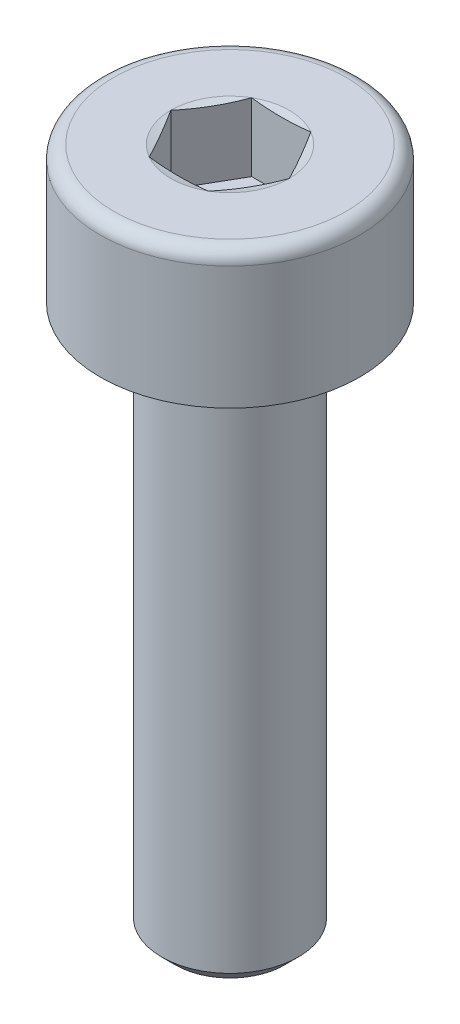
ISO-10303-21;
HEADER;
FILE_DESCRIPTION(('STEP AP214'),'2;1');
FILE_NAME('part.step','',(''),(''),'','','');
FILE_SCHEMA(('AUTOMOTIVE_DESIGN { 1 0 10303 214 1 1 1 1 }'));
ENDSEC;
DATA;
#1=APPLICATION_CONTEXT('core data for automotive mechanical design processes');
#2=APPLICATION_PROTOCOL_DEFINITION('international standard','automotive_design',2000,#1);
#3=PRODUCT_CONTEXT('',#1,'mechanical');
#4=PRODUCT('Part','Part','',(#3));
#5=PRODUCT_RELATED_PRODUCT_CATEGORY('part','',(#4));
#6=PRODUCT_DEFINITION_FORMATION('','',#4);
#7=PRODUCT_DEFINITION_CONTEXT('part definition',#1,'design');
#8=PRODUCT_DEFINITION('design','',#6,#7);
#9=PRODUCT_DEFINITION_SHAPE('','',#8);
#10=(LENGTH_UNIT() NAMED_UNIT(*) SI_UNIT(.MILLI.,.METRE.));
#11=(NAMED_UNIT(*) PLANE_ANGLE_UNIT() SI_UNIT($,.RADIAN.));
#12=(NAMED_UNIT(*) SI_UNIT($,.STERADIAN.) SOLID_ANGLE_UNIT());
#13=UNCERTAINTY_MEASURE_WITH_UNIT(LENGTH_MEASURE(1.E-05),#10,'distance_accuracy_value','');
#14=(GEOMETRIC_REPRESENTATION_CONTEXT(3) GLOBAL_UNCERTAINTY_ASSIGNED_CONTEXT((#13)) GLOBAL_UNIT_ASSIGNED_CONTEXT((#10,
#11,#12)) REPRESENTATION_CONTEXT('',''));
#15=CARTESIAN_POINT('',(0.,0.,0.));
#16=DIRECTION('',(0.,0.,1.));
#17=DIRECTION('',(1.,0.,0.));
#18=AXIS2_PLACEMENT_3D('',#15,#16,#17);
#19=CARTESIAN_POINT('',(-0.43301270189222,1.,-0.75));
#20=DIRECTION('',(0.,-1.,0.));
#21=DIRECTION('',(0.,0.,-1.));
#22=AXIS2_PLACEMENT_3D('',#19,#20,#21);
#23=PLANE('',#22);
#24=DIRECTION('',(0.5,0.,0.866025403784438));
#25=VECTOR('',#24,1.);
#26=CARTESIAN_POINT('',(-0.433012701892219,1.,0.75));
#27=LINE('',#26,#25);
#28=CARTESIAN_POINT('',(-0.866025403784439,1.,0.));
#29=VERTEX_POINT('',#28);
#30=CARTESIAN_POINT('',(-0.433012701892219,1.,0.75));
#31=VERTEX_POINT('',#30);
#32=EDGE_CURVE('E233',#29,#31,#27,.T.);
#33=ORIENTED_EDGE('',*,*,#32,.T.);
#34=DIRECTION('',(1.,0.,0.));
#35=VECTOR('',#34,1.);
#36=CARTESIAN_POINT('',(0.433012701892219,1.,0.75));
#37=LINE('',#36,#35);
#38=CARTESIAN_POINT('',(0.433012701892219,1.,0.75));
#39=VERTEX_POINT('',#38);
#40=EDGE_CURVE('E237',#31,#39,#37,.T.);
#41=ORIENTED_EDGE('',*,*,#40,.T.);
#42=DIRECTION('',(0.5,0.,-0.866025403784438));
#43=VECTOR('',#42,1.);
#44=CARTESIAN_POINT('',(0.866025403784439,1.,0.));
#45=LINE('',#44,#43);
#46=CARTESIAN_POINT('',(0.866025403784439,1.,0.));
#47=VERTEX_POINT('',#46);
#48=EDGE_CURVE('E240',#39,#47,#45,.T.);
#49=ORIENTED_EDGE('',*,*,#48,.T.);
#50=DIRECTION('',(-0.5,0.,-0.866025403784439));
#51=VECTOR('',#50,1.);
#52=CARTESIAN_POINT('',(0.43301270189222,1.,-0.75));
#53=LINE('',#52,#51);
#54=CARTESIAN_POINT('',(0.43301270189222,1.,-0.75));
#55=VERTEX_POINT('',#54);
#56=EDGE_CURVE('E96',#47,#55,#53,.T.);
#57=ORIENTED_EDGE('',*,*,#56,.T.);
#58=DIRECTION('',(-1.,0.,0.));
#59=VECTOR('',#58,1.);
#60=CARTESIAN_POINT('',(-0.43301270189222,1.,-0.75));
#61=LINE('',#60,#59);
#62=CARTESIAN_POINT('',(-0.43301270189222,1.,-0.75));
#63=VERTEX_POINT('',#62);
#64=EDGE_CURVE('E223',#55,#63,#61,.T.);
#65=ORIENTED_EDGE('',*,*,#64,.T.);
#66=DIRECTION('',(-0.5,0.,0.866025403784439));
#67=VECTOR('',#66,1.);
#68=CARTESIAN_POINT('',(-0.866025403784439,1.,0.));
#69=LINE('',#68,#67);
#70=EDGE_CURVE('E228',#63,#29,#69,.T.);
#71=ORIENTED_EDGE('',*,*,#70,.T.);
#72=EDGE_LOOP('',(#33,#41,#49,#57,#65,#71));
#73=FACE_BOUND('',#72,.T.);
#74=ADVANCED_FACE('F17',(#73),#23,.F.);
#75=CARTESIAN_POINT('',(0.866025403784439,1.,0.));
#76=DIRECTION('',(0.866025403784438,0.,0.5));
#77=DIRECTION('',(0.5,0.,-0.866025403784438));
#78=AXIS2_PLACEMENT_3D('',#75,#76,#77);
#79=PLANE('',#78);
#80=CARTESIAN_POINT('',(0.43301270189222,2.,0.75));
#81=CARTESIAN_POINT('',(0.458011996942442,1.99332894284484,0.706699950819609));
#82=CARTESIAN_POINT('',(0.483084241722884,1.9878511257841,0.663273549000079));
#83=CARTESIAN_POINT('',(0.533331856783253,1.97923324222689,0.576242126756357));
#84=CARTESIAN_POINT('',(0.558507237671917,1.9760934226167,0.532637087957293));
#85=CARTESIAN_POINT('',(0.633798363297738,1.97013471304087,0.402229033014321));
#86=CARTESIAN_POINT('',(0.683995304960254,1.9706938931653,0.31528537967027));
#87=CARTESIAN_POINT('',(0.75609458989346,1.97803638281175,0.190405754976572));
#88=CARTESIAN_POINT('',(0.778106545273776,1.98116039104902,0.152279929883928));
#89=CARTESIAN_POINT('',(0.822106353110896,1.98921327605727,0.0760700271867688));
#90=CARTESIAN_POINT('',(0.844093987710657,1.99414690623184,0.0379863269217234));
#91=CARTESIAN_POINT('',(0.866025403784438,2.,0.));
#92=B_SPLINE_CURVE_WITH_KNOTS('',3,(#80,#81,#82,#83,#84,#85,#86,#87,#88,#89,#90,#91),
.UNSPECIFIED.,.F.,.F.,(4,2,2,2,2,4),(0.,0.151285873320482,0.302587719760197,0.603284766353558,
0.735660385742495,0.868386240938901),.UNSPECIFIED.);
#93=CARTESIAN_POINT('',(0.433012701892219,2.,0.75));
#94=VERTEX_POINT('',#93);
#95=CARTESIAN_POINT('',(0.866025403784439,2.,0.));
#96=VERTEX_POINT('',#95);
#97=EDGE_CURVE('E79',#94,#96,#92,.T.);
#98=ORIENTED_EDGE('',*,*,#97,.T.);
#99=DIRECTION('',(0.,1.,0.));
#100=VECTOR('',#99,1.);
#101=CARTESIAN_POINT('',(0.866025403784439,1.,0.));
#102=LINE('',#101,#100);
#103=EDGE_CURVE('E82',#96,#47,#102,.F.);
#104=ORIENTED_EDGE('',*,*,#103,.T.);
#105=ORIENTED_EDGE('',*,*,#48,.F.);
#106=DIRECTION('',(0.,1.,0.));
#107=VECTOR('',#106,1.);
#108=CARTESIAN_POINT('',(0.433012701892219,1.,0.75));
#109=LINE('',#108,#107);
#110=EDGE_CURVE('E75',#39,#94,#109,.T.);
#111=ORIENTED_EDGE('',*,*,#110,.T.);
#112=EDGE_LOOP('',(#98,#104,#105,#111));
#113=FACE_BOUND('',#112,.T.);
#114=ADVANCED_FACE('F81',(#113),#79,.F.);
#115=CARTESIAN_POINT('',(0.433012701892219,1.,0.75));
#116=DIRECTION('',(0.,0.,1.));
#117=DIRECTION('',(1.,0.,0.));
#118=AXIS2_PLACEMENT_3D('',#115,#116,#117);
#119=PLANE('',#118);
#120=CARTESIAN_POINT('',(-0.43301270189222,2.,0.75));
#121=CARTESIAN_POINT('',(-0.383014111791775,1.99332894284484,0.75));
#122=CARTESIAN_POINT('',(-0.332869622230889,1.9878511257841,0.75));
#123=CARTESIAN_POINT('',(-0.232374392110151,1.97923324222689,0.75));
#124=CARTESIAN_POINT('',(-0.182023630332824,1.9760934226167,0.75));
#125=CARTESIAN_POINT('',(-0.0314413790811828,1.97013471304087,0.75));
#126=CARTESIAN_POINT('',(0.0689525042438513,1.9706938931653,0.75));
#127=CARTESIAN_POINT('',(0.213151074110263,1.97803638281175,0.75));
#128=CARTESIAN_POINT('',(0.257174984870893,1.98116039104902,0.75));
#129=CARTESIAN_POINT('',(0.345174600545133,1.98921327605727,0.75));
#130=CARTESIAN_POINT('',(0.389149869744655,1.99414690623184,0.75));
#131=CARTESIAN_POINT('',(0.433012701892219,2.,0.75));
#132=B_SPLINE_CURVE_WITH_KNOTS('',3,(#120,#121,#122,#123,#124,#125,#126,#127,#128,#129,#130,
#131),.UNSPECIFIED.,.F.,.F.,(4,2,2,2,2,4),(0.,0.151285873320482,0.302587719760197,
0.603284766353558,0.735660385742495,0.868386240938901),.UNSPECIFIED.);
#133=CARTESIAN_POINT('',(-0.433012701892219,2.,0.75));
#134=VERTEX_POINT('',#133);
#135=EDGE_CURVE('E87',#134,#94,#132,.T.);
#136=ORIENTED_EDGE('',*,*,#135,.T.);
#137=ORIENTED_EDGE('',*,*,#110,.F.);
#138=ORIENTED_EDGE('',*,*,#40,.F.);
#139=DIRECTION('',(0.,1.,0.));
#140=VECTOR('',#139,1.);
#141=CARTESIAN_POINT('',(-0.433012701892219,1.,0.75));
#142=LINE('',#141,#140);
#143=EDGE_CURVE('E231',#31,#134,#142,.T.);
#144=ORIENTED_EDGE('',*,*,#143,.T.);
#145=EDGE_LOOP('',(#136,#137,#138,#144));
#146=FACE_BOUND('',#145,.T.);
#147=ADVANCED_FACE('F195',(#146),#119,.F.);
#148=CARTESIAN_POINT('',(-0.433012701892219,1.,0.75));
#149=DIRECTION('',(-0.866025403784438,0.,0.5));
#150=DIRECTION('',(0.5,0.,0.866025403784438));
#151=AXIS2_PLACEMENT_3D('',#148,#149,#150);
#152=PLANE('',#151);
#153=CARTESIAN_POINT('',(-0.866025403784439,2.,0.));
#154=CARTESIAN_POINT('',(-0.841026108734216,1.99332894284484,0.0433000491803905));
#155=CARTESIAN_POINT('',(-0.815953863953774,1.9878511257841,0.0867264509999211));
#156=CARTESIAN_POINT('',(-0.765706248893405,1.97923324222689,0.173757873243643));
#157=CARTESIAN_POINT('',(-0.740530868004741,1.9760934226167,0.217362912042706));
#158=CARTESIAN_POINT('',(-0.665239742378921,1.97013471304087,0.347770966985679));
#159=CARTESIAN_POINT('',(-0.615042800716404,1.9706938931653,0.43471462032973));
#160=CARTESIAN_POINT('',(-0.542943515783198,1.97803638281175,0.559594245023428));
#161=CARTESIAN_POINT('',(-0.520931560402882,1.98116039104902,0.597720070116072));
#162=CARTESIAN_POINT('',(-0.476931752565762,1.98921327605727,0.673929972813231));
#163=CARTESIAN_POINT('',(-0.454944117966001,1.99414690623184,0.712013673078277));
#164=CARTESIAN_POINT('',(-0.433012701892219,2.,0.75));
#165=B_SPLINE_CURVE_WITH_KNOTS('',3,(#153,#154,#155,#156,#157,#158,#159,#160,#161,#162,#163,
#164),.UNSPECIFIED.,.F.,.F.,(4,2,2,2,2,4),(0.,0.151285873320482,0.302587719760197,
0.603284766353558,0.735660385742495,0.868386240938901),.UNSPECIFIED.);
#166=CARTESIAN_POINT('',(-0.866025403784439,2.,0.));
#167=VERTEX_POINT('',#166);
#168=EDGE_CURVE('E179',#167,#134,#165,.T.);
#169=ORIENTED_EDGE('',*,*,#168,.T.);
#170=ORIENTED_EDGE('',*,*,#143,.F.);
#171=ORIENTED_EDGE('',*,*,#32,.F.);
#172=DIRECTION('',(0.,1.,0.));
#173=VECTOR('',#172,1.);
#174=CARTESIAN_POINT('',(-0.866025403784439,1.,0.));
#175=LINE('',#174,#173);
#176=EDGE_CURVE('E226',#29,#167,#175,.T.);
#177=ORIENTED_EDGE('',*,*,#176,.T.);
#178=EDGE_LOOP('',(#169,#170,#171,#177));
#179=FACE_BOUND('',#178,.T.);
#180=ADVANCED_FACE('F189',(#179),#152,.F.);
#181=CARTESIAN_POINT('',(-0.866025403784439,1.,0.));
#182=DIRECTION('',(-0.866025403784439,0.,-0.5));
#183=DIRECTION('',(-0.5,0.,0.866025403784439));
#184=AXIS2_PLACEMENT_3D('',#181,#182,#183);
#185=PLANE('',#184);
#186=CARTESIAN_POINT('',(-0.43301270189222,2.,-0.75));
#187=CARTESIAN_POINT('',(-0.458011996942442,1.99332894284484,-0.706699950819609));
#188=CARTESIAN_POINT('',(-0.483084241722885,1.9878511257841,-0.663273549000078));
#189=CARTESIAN_POINT('',(-0.533331856783254,1.97923324222689,-0.576242126756356));
#190=CARTESIAN_POINT('',(-0.558507237671917,1.9760934226167,-0.532637087957293));
#191=CARTESIAN_POINT('',(-0.633798363297738,1.97013471304087,-0.40222903301432));
#192=CARTESIAN_POINT('',(-0.683995304960255,1.9706938931653,-0.31528537967027));
#193=CARTESIAN_POINT('',(-0.756094589893461,1.97803638281175,-0.190405754976572));
#194=CARTESIAN_POINT('',(-0.778106545273776,1.98116039104902,-0.152279929883927));
#195=CARTESIAN_POINT('',(-0.822106353110896,1.98921327605727,-0.0760700271867685));
#196=CARTESIAN_POINT('',(-0.844093987710657,1.99414690623184,-0.0379863269217232));
#197=CARTESIAN_POINT('',(-0.866025403784439,2.,0.));
#198=B_SPLINE_CURVE_WITH_KNOTS('',3,(#186,#187,#188,#189,#190,#191,#192,#193,#194,#195,#196,
#197),.UNSPECIFIED.,.F.,.F.,(4,2,2,2,2,4),(0.,0.151285873320482,0.302587719760197,
0.603284766353558,0.735660385742494,0.8683862409389),.UNSPECIFIED.);
#199=CARTESIAN_POINT('',(-0.43301270189222,2.,-0.75));
#200=VERTEX_POINT('',#199);
#201=EDGE_CURVE('E172',#200,#167,#198,.T.);
#202=ORIENTED_EDGE('',*,*,#201,.T.);
#203=ORIENTED_EDGE('',*,*,#176,.F.);
#204=ORIENTED_EDGE('',*,*,#70,.F.);
#205=DIRECTION('',(0.,1.,0.));
#206=VECTOR('',#205,1.);
#207=CARTESIAN_POINT('',(-0.43301270189222,1.,-0.75));
#208=LINE('',#207,#206);
#209=EDGE_CURVE('E221',#63,#200,#208,.T.);
#210=ORIENTED_EDGE('',*,*,#209,.T.);
#211=EDGE_LOOP('',(#202,#203,#204,#210));
#212=FACE_BOUND('',#211,.T.);
#213=ADVANCED_FACE('F185',(#212),#185,.F.);
#214=CARTESIAN_POINT('',(-0.43301270189222,1.,-0.75));
#215=DIRECTION('',(0.,0.,-1.));
#216=DIRECTION('',(-1.,0.,0.));
#217=AXIS2_PLACEMENT_3D('',#214,#215,#216);
#218=PLANE('',#217);
#219=CARTESIAN_POINT('',(0.433012701892219,2.,-0.75));
#220=CARTESIAN_POINT('',(0.383014111791774,1.99332894284484,-0.75));
#221=CARTESIAN_POINT('',(0.332869622230888,1.9878511257841,-0.75));
#222=CARTESIAN_POINT('',(0.23237439211015,1.97923324222689,-0.75));
#223=CARTESIAN_POINT('',(0.182023630332824,1.9760934226167,-0.75));
#224=CARTESIAN_POINT('',(0.0314413790811823,1.97013471304087,-0.75));
#225=CARTESIAN_POINT('',(-0.0689525042438517,1.9706938931653,-0.750000000000001));
#226=CARTESIAN_POINT('',(-0.213151074110264,1.97803638281175,-0.75));
#227=CARTESIAN_POINT('',(-0.257174984870894,1.98116039104902,-0.75));
#228=CARTESIAN_POINT('',(-0.345174600545134,1.98921327605727,-0.749999999999999));
#229=CARTESIAN_POINT('',(-0.389149869744656,1.99414690623184,-0.749999999999999));
#230=CARTESIAN_POINT('',(-0.43301270189222,2.,-0.749999999999999));
#231=B_SPLINE_CURVE_WITH_KNOTS('',3,(#219,#220,#221,#222,#223,#224,#225,#226,#227,#228,#229,
#230),.UNSPECIFIED.,.F.,.F.,(4,2,2,2,2,4),(0.,0.151285873320482,0.302587719760197,
0.603284766353558,0.735660385742495,0.868386240938901),.UNSPECIFIED.);
#232=CARTESIAN_POINT('',(0.433012701892219,2.,-0.75));
#233=VERTEX_POINT('',#232);
#234=EDGE_CURVE('E112',#233,#200,#231,.T.);
#235=ORIENTED_EDGE('',*,*,#234,.T.);
#236=ORIENTED_EDGE('',*,*,#209,.F.);
#237=ORIENTED_EDGE('',*,*,#64,.F.);
#238=DIRECTION('',(0.,1.,0.));
#239=VECTOR('',#238,1.);
#240=CARTESIAN_POINT('',(0.43301270189222,1.,-0.75));
#241=LINE('',#240,#239);
#242=EDGE_CURVE('E97',#55,#233,#241,.T.);
#243=ORIENTED_EDGE('',*,*,#242,.T.);
#244=EDGE_LOOP('',(#235,#236,#237,#243));
#245=FACE_BOUND('',#244,.T.);
#246=ADVANCED_FACE('F188',(#245),#218,.F.);
#247=CARTESIAN_POINT('',(0.43301270189222,1.,-0.75));
#248=DIRECTION('',(0.866025403784439,0.,-0.5));
#249=DIRECTION('',(-0.5,0.,-0.866025403784439));
#250=AXIS2_PLACEMENT_3D('',#247,#248,#249);
#251=PLANE('',#250);
#252=CARTESIAN_POINT('',(0.866025403784438,2.,0.));
#253=CARTESIAN_POINT('',(0.841026108734216,1.99332894284484,-0.0433000491803903));
#254=CARTESIAN_POINT('',(0.815953863953773,1.9878511257841,-0.0867264509999209));
#255=CARTESIAN_POINT('',(0.765706248893404,1.97923324222689,-0.173757873243643));
#256=CARTESIAN_POINT('',(0.740530868004741,1.9760934226167,-0.217362912042706));
#257=CARTESIAN_POINT('',(0.66523974237892,1.97013471304087,-0.347770966985679));
#258=CARTESIAN_POINT('',(0.615042800716403,1.9706938931653,-0.434714620329729));
#259=CARTESIAN_POINT('',(0.542943515783197,1.97803638281175,-0.559594245023427));
#260=CARTESIAN_POINT('',(0.520931560402882,1.98116039104902,-0.597720070116072));
#261=CARTESIAN_POINT('',(0.476931752565762,1.98921327605727,-0.673929972813232));
#262=CARTESIAN_POINT('',(0.454944117966001,1.99414690623184,-0.712013673078277));
#263=CARTESIAN_POINT('',(0.433012701892219,2.,-0.750000000000001));
#264=B_SPLINE_CURVE_WITH_KNOTS('',3,(#252,#253,#254,#255,#256,#257,#258,#259,#260,#261,#262,
#263),.UNSPECIFIED.,.F.,.F.,(4,2,2,2,2,4),(0.,0.151285873320482,0.302587719760197,
0.603284766353558,0.735660385742495,0.868386240938902),.UNSPECIFIED.);
#265=EDGE_CURVE('E94',#96,#233,#264,.T.);
#266=ORIENTED_EDGE('',*,*,#265,.T.);
#267=ORIENTED_EDGE('',*,*,#242,.F.);
#268=ORIENTED_EDGE('',*,*,#56,.F.);
#269=ORIENTED_EDGE('',*,*,#103,.F.);
#270=EDGE_LOOP('',(#266,#267,#268,#269));
#271=FACE_BOUND('',#270,.T.);
#272=ADVANCED_FACE('F91',(#271),#251,.F.);
#273=CARTESIAN_POINT('',(-0.0925408930275514,4.89857235749242,0.));
#274=DIRECTION('',(0.,0.,1.));
#275=DIRECTION('',(-1.,0.,0.));
#276=AXIS2_PLACEMENT_3D('',#273,#274,#275);
#277=CIRCLE('',#276,3.);
#278=TRIMMED_CURVE('',#277,(PARAMETER_VALUE(-1.60164818522875)),
(PARAMETER_VALUE(1.60164818522875)),.T.,.PARAMETER.);
#279=CARTESIAN_POINT('',(0.,4.89857235749242,0.));
#280=DIRECTION('',(0.,1.,0.));
#281=AXIS1_PLACEMENT('',#279,#280);
#282=SURFACE_OF_REVOLUTION('',#278,#281);
#283=ORIENTED_EDGE('',*,*,#97,.F.);
#284=CARTESIAN_POINT('',(0.,2.,0.));
#285=DIRECTION('',(0.,1.,0.));
#286=DIRECTION('',(-1.,0.,0.));
#287=AXIS2_PLACEMENT_3D('',#284,#285,#286);
#288=CIRCLE('',#287,0.866025403784438);
#289=EDGE_CURVE('E100',#96,#94,#288,.F.);
#290=ORIENTED_EDGE('',*,*,#289,.F.);
#291=EDGE_LOOP('',(#283,#290));
#292=FACE_BOUND('',#291,.T.);
#293=ADVANCED_FACE('F101',(#292),#282,.T.);
#294=CARTESIAN_POINT('',(-0.0925408930275514,4.89857235749242,0.));
#295=DIRECTION('',(0.,0.,1.));
#296=DIRECTION('',(-1.,0.,0.));
#297=AXIS2_PLACEMENT_3D('',#294,#295,#296);
#298=CIRCLE('',#297,3.);
#299=TRIMMED_CURVE('',#298,(PARAMETER_VALUE(-1.60164818522875)),
(PARAMETER_VALUE(1.60164818522875)),.T.,.PARAMETER.);
#300=CARTESIAN_POINT('',(0.,4.89857235749242,0.));
#301=DIRECTION('',(0.,1.,0.));
#302=AXIS1_PLACEMENT('',#300,#301);
#303=SURFACE_OF_REVOLUTION('',#299,#302);
#304=ORIENTED_EDGE('',*,*,#135,.F.);
#305=CARTESIAN_POINT('',(0.,2.,0.));
#306=DIRECTION('',(0.,1.,0.));
#307=DIRECTION('',(-1.,0.,0.));
#308=AXIS2_PLACEMENT_3D('',#305,#306,#307);
#309=CIRCLE('',#308,0.866025403784438);
#310=EDGE_CURVE('E105',#94,#134,#309,.F.);
#311=ORIENTED_EDGE('',*,*,#310,.F.);
#312=EDGE_LOOP('',(#304,#311));
#313=FACE_BOUND('',#312,.T.);
#314=ADVANCED_FACE('F207',(#313),#303,.T.);
#315=CARTESIAN_POINT('',(-0.0925408930275514,4.89857235749242,0.));
#316=DIRECTION('',(0.,0.,1.));
#317=DIRECTION('',(-1.,0.,0.));
#318=AXIS2_PLACEMENT_3D('',#315,#316,#317);
#319=CIRCLE('',#318,3.);
#320=TRIMMED_CURVE('',#319,(PARAMETER_VALUE(-1.60164818522875)),
(PARAMETER_VALUE(1.60164818522875)),.T.,.PARAMETER.);
#321=CARTESIAN_POINT('',(0.,4.89857235749242,0.));
#322=DIRECTION('',(0.,1.,0.));
#323=AXIS1_PLACEMENT('',#321,#322);
#324=SURFACE_OF_REVOLUTION('',#320,#323);
#325=ORIENTED_EDGE('',*,*,#168,.F.);
#326=CARTESIAN_POINT('',(0.,2.,0.));
#327=DIRECTION('',(0.,1.,0.));
#328=DIRECTION('',(-1.,0.,0.));
#329=AXIS2_PLACEMENT_3D('',#326,#327,#328);
#330=CIRCLE('',#329,0.866025403784439);
#331=EDGE_CURVE('E127',#134,#167,#330,.F.);
#332=ORIENTED_EDGE('',*,*,#331,.F.);
#333=EDGE_LOOP('',(#325,#332));
#334=FACE_BOUND('',#333,.T.);
#335=ADVANCED_FACE('F168',(#334),#324,.T.);
#336=CARTESIAN_POINT('',(-0.0925408930275514,4.89857235749242,0.));
#337=DIRECTION('',(0.,0.,1.));
#338=DIRECTION('',(-1.,0.,0.));
#339=AXIS2_PLACEMENT_3D('',#336,#337,#338);
#340=CIRCLE('',#339,3.);
#341=TRIMMED_CURVE('',#340,(PARAMETER_VALUE(-1.60164818522875)),
(PARAMETER_VALUE(1.60164818522875)),.T.,.PARAMETER.);
#342=CARTESIAN_POINT('',(0.,4.89857235749242,0.));
#343=DIRECTION('',(0.,1.,0.));
#344=AXIS1_PLACEMENT('',#342,#343);
#345=SURFACE_OF_REVOLUTION('',#341,#344);
#346=ORIENTED_EDGE('',*,*,#201,.F.);
#347=CARTESIAN_POINT('',(0.,2.,0.));
#348=DIRECTION('',(0.,1.,0.));
#349=DIRECTION('',(-1.,0.,0.));
#350=AXIS2_PLACEMENT_3D('',#347,#348,#349);
#351=CIRCLE('',#350,0.866025403784439);
#352=EDGE_CURVE('E120',#167,#200,#351,.F.);
#353=ORIENTED_EDGE('',*,*,#352,.F.);
#354=EDGE_LOOP('',(#346,#353));
#355=FACE_BOUND('',#354,.T.);
#356=ADVANCED_FACE('F164',(#355),#345,.T.);
#357=CARTESIAN_POINT('',(-0.0925408930275514,4.89857235749242,0.));
#358=DIRECTION('',(0.,0.,1.));
#359=DIRECTION('',(-1.,0.,0.));
#360=AXIS2_PLACEMENT_3D('',#357,#358,#359);
#361=CIRCLE('',#360,3.);
#362=TRIMMED_CURVE('',#361,(PARAMETER_VALUE(-1.60164818522875)),
(PARAMETER_VALUE(1.60164818522875)),.T.,.PARAMETER.);
#363=CARTESIAN_POINT('',(0.,4.89857235749242,0.));
#364=DIRECTION('',(0.,1.,0.));
#365=AXIS1_PLACEMENT('',#363,#364);
#366=SURFACE_OF_REVOLUTION('',#362,#365);
#367=ORIENTED_EDGE('',*,*,#234,.F.);
#368=CARTESIAN_POINT('',(0.,2.,0.));
#369=DIRECTION('',(0.,1.,0.));
#370=DIRECTION('',(-1.,0.,0.));
#371=AXIS2_PLACEMENT_3D('',#368,#369,#370);
#372=CIRCLE('',#371,0.866025403784439);
#373=EDGE_CURVE('E117',#200,#233,#372,.F.);
#374=ORIENTED_EDGE('',*,*,#373,.F.);
#375=EDGE_LOOP('',(#367,#374));
#376=FACE_BOUND('',#375,.T.);
#377=ADVANCED_FACE('F148',(#376),#366,.T.);
#378=CARTESIAN_POINT('',(-0.0925408930275514,4.89857235749242,0.));
#379=DIRECTION('',(0.,0.,1.));
#380=DIRECTION('',(-1.,0.,0.));
#381=AXIS2_PLACEMENT_3D('',#378,#379,#380);
#382=CIRCLE('',#381,3.);
#383=TRIMMED_CURVE('',#382,(PARAMETER_VALUE(-1.60164818522875)),
(PARAMETER_VALUE(1.60164818522875)),.T.,.PARAMETER.);
#384=CARTESIAN_POINT('',(0.,4.89857235749242,0.));
#385=DIRECTION('',(0.,1.,0.));
#386=AXIS1_PLACEMENT('',#384,#385);
#387=SURFACE_OF_REVOLUTION('',#383,#386);
#388=ORIENTED_EDGE('',*,*,#265,.F.);
#389=CARTESIAN_POINT('',(0.,2.,0.));
#390=DIRECTION('',(0.,1.,0.));
#391=DIRECTION('',(-1.,0.,0.));
#392=AXIS2_PLACEMENT_3D('',#389,#390,#391);
#393=CIRCLE('',#392,0.866025403784439);
#394=EDGE_CURVE('E110',#233,#96,#393,.F.);
#395=ORIENTED_EDGE('',*,*,#394,.F.);
#396=EDGE_LOOP('',(#388,#395));
#397=FACE_BOUND('',#396,.T.);
#398=ADVANCED_FACE('F109',(#397),#387,.T.);
#399=CARTESIAN_POINT('',(0.,2.,0.));
#400=DIRECTION('',(0.,1.,0.));
#401=DIRECTION('',(0.,0.,1.));
#402=AXIS2_PLACEMENT_3D('',#399,#400,#401);
#403=PLANE('',#402);
#404=CARTESIAN_POINT('',(0.,2.,0.));
#405=DIRECTION('',(0.,-1.,0.));
#406=DIRECTION('',(0.,0.,-1.));
#407=AXIS2_PLACEMENT_3D('',#404,#405,#406);
#408=CIRCLE('',#407,1.7);
#409=CARTESIAN_POINT('',(0.,2.,-1.7));
#410=VERTEX_POINT('',#409);
#411=CARTESIAN_POINT('',(0.,2.,1.7));
#412=VERTEX_POINT('',#411);
#413=EDGE_CURVE('E36',#410,#412,#408,.T.);
#414=ORIENTED_EDGE('',*,*,#413,.F.);
#415=CARTESIAN_POINT('',(0.,2.,0.));
#416=DIRECTION('',(0.,-1.,0.));
#417=DIRECTION('',(0.,0.,1.));
#418=AXIS2_PLACEMENT_3D('',#415,#416,#417);
#419=CIRCLE('',#418,1.7);
#420=EDGE_CURVE('E119',#412,#410,#419,.T.);
#421=ORIENTED_EDGE('',*,*,#420,.F.);
#422=EDGE_LOOP('',(#414,#421));
#423=FACE_BOUND('',#422,.T.);
#424=ORIENTED_EDGE('',*,*,#373,.T.);
#425=ORIENTED_EDGE('',*,*,#394,.T.);
#426=ORIENTED_EDGE('',*,*,#289,.T.);
#427=ORIENTED_EDGE('',*,*,#310,.T.);
#428=ORIENTED_EDGE('',*,*,#331,.T.);
#429=ORIENTED_EDGE('',*,*,#352,.T.);
#430=EDGE_LOOP('',(#424,#425,#426,#427,#428,#429));
#431=FACE_BOUND('',#430,.T.);
#432=ADVANCED_FACE('F114',(#423,#431),#403,.T.);
#433=CARTESIAN_POINT('',(0.,1.8,0.));
#434=DIRECTION('',(0.,1.,0.));
#435=DIRECTION('',(0.,0.,1.));
#436=AXIS2_PLACEMENT_3D('',#433,#434,#435);
#437=TOROIDAL_SURFACE('',#436,1.7,0.2);
#438=CARTESIAN_POINT('',(0.,1.8,0.));
#439=DIRECTION('',(0.,-1.,0.));
#440=DIRECTION('',(0.,0.,-1.));
#441=AXIS2_PLACEMENT_3D('',#438,#439,#440);
#442=CIRCLE('',#441,1.9);
#443=CARTESIAN_POINT('',(0.,1.8,-1.9));
#444=VERTEX_POINT('',#443);
#445=EDGE_CURVE('E265',#444,#444,#442,.T.);
#446=ORIENTED_EDGE('',*,*,#445,.F.);
#447=EDGE_LOOP('',(#446));
#448=FACE_BOUND('',#447,.T.);
#449=ORIENTED_EDGE('',*,*,#420,.T.);
#450=ORIENTED_EDGE('',*,*,#413,.T.);
#451=EDGE_LOOP('',(#449,#450));
#452=FACE_BOUND('',#451,.T.);
#453=ADVANCED_FACE('F276',(#448,#452),#437,.T.);
#454=CARTESIAN_POINT('',(0.,-8.,0.));
#455=DIRECTION('',(0.,-1.,0.));
#456=DIRECTION('',(0.,0.,-1.));
#457=AXIS2_PLACEMENT_3D('',#454,#455,#456);
#458=PLANE('',#457);
#459=CARTESIAN_POINT('',(0.,-7.99999999998136,0.));
#460=DIRECTION('',(0.,1.,0.));
#461=DIRECTION('',(0.,0.,1.));
#462=AXIS2_PLACEMENT_3D('',#459,#460,#461);
#463=CIRCLE('',#462,0.799999999969714);
#464=CARTESIAN_POINT('',(0.,-7.99999999998136,0.799999999969714));
#465=VERTEX_POINT('',#464);
#466=EDGE_CURVE('E123',#465,#465,#463,.T.);
#467=ORIENTED_EDGE('',*,*,#466,.F.);
#468=EDGE_LOOP('',(#467));
#469=FACE_BOUND('',#468,.T.);
#470=ADVANCED_FACE('F280',(#469),#458,.T.);
#471=CARTESIAN_POINT('',(0.,2.,0.));
#472=DIRECTION('',(0.,-1.,0.));
#473=DIRECTION('',(0.,0.,-1.));
#474=AXIS2_PLACEMENT_3D('',#471,#472,#473);
#475=CYLINDRICAL_SURFACE('',#474,1.9);
#476=ORIENTED_EDGE('',*,*,#445,.T.);
#477=EDGE_LOOP('',(#476));
#478=FACE_BOUND('',#477,.T.);
#479=CARTESIAN_POINT('',(0.,0.,0.));
#480=DIRECTION('',(0.,-1.,0.));
#481=DIRECTION('',(0.,0.,-1.));
#482=AXIS2_PLACEMENT_3D('',#479,#480,#481);
#483=CIRCLE('',#482,1.9);
#484=CARTESIAN_POINT('',(0.,0.,-1.9));
#485=VERTEX_POINT('',#484);
#486=EDGE_CURVE('E258',#485,#485,#483,.F.);
#487=ORIENTED_EDGE('',*,*,#486,.T.);
#488=EDGE_LOOP('',(#487));
#489=FACE_BOUND('',#488,.T.);
#490=ADVANCED_FACE('F285',(#478,#489),#475,.T.);
#491=CARTESIAN_POINT('',(0.,-7.8000000000884,0.));
#492=DIRECTION('',(0.,1.,0.));
#493=DIRECTION('',(0.,0.,1.));
#494=AXIS2_PLACEMENT_3D('',#491,#492,#493);
#495=CONICAL_SURFACE('',#494,0.999999999862666,0.785398163397448);
#496=CARTESIAN_POINT('',(0.,-7.8,0.));
#497=DIRECTION('',(0.,1.,0.));
#498=DIRECTION('',(0.,0.,1.));
#499=AXIS2_PLACEMENT_3D('',#496,#497,#498);
#500=CIRCLE('',#499,1.);
#501=CARTESIAN_POINT('',(0.,-7.8,1.));
#502=VERTEX_POINT('',#501);
#503=EDGE_CURVE('E28',#502,#502,#500,.T.);
#504=ORIENTED_EDGE('',*,*,#503,.F.);
#505=EDGE_LOOP('',(#504));
#506=FACE_BOUND('',#505,.T.);
#507=ORIENTED_EDGE('',*,*,#466,.T.);
#508=EDGE_LOOP('',(#507));
#509=FACE_BOUND('',#508,.T.);
#510=ADVANCED_FACE('F289',(#506,#509),#495,.T.);
#511=CARTESIAN_POINT('',(0.,0.,0.));
#512=DIRECTION('',(0.,1.,0.));
#513=DIRECTION('',(0.,0.,1.));
#514=AXIS2_PLACEMENT_3D('',#511,#512,#513);
#515=PLANE('',#514);
#516=CARTESIAN_POINT('',(0.,0.,0.));
#517=DIRECTION('',(0.,1.,0.));
#518=DIRECTION('',(0.,0.,1.));
#519=AXIS2_PLACEMENT_3D('',#516,#517,#518);
#520=CIRCLE('',#519,1.);
#521=CARTESIAN_POINT('',(0.,0.,1.));
#522=VERTEX_POINT('',#521);
#523=EDGE_CURVE('E11',#522,#522,#520,.F.);
#524=ORIENTED_EDGE('',*,*,#523,.F.);
#525=EDGE_LOOP('',(#524));
#526=FACE_BOUND('',#525,.T.);
#527=ORIENTED_EDGE('',*,*,#486,.F.);
#528=EDGE_LOOP('',(#527));
#529=FACE_BOUND('',#528,.T.);
#530=ADVANCED_FACE('F292',(#526,#529),#515,.F.);
#531=CARTESIAN_POINT('',(0.,-8.,0.));
#532=DIRECTION('',(0.,1.,0.));
#533=DIRECTION('',(0.,0.,1.));
#534=AXIS2_PLACEMENT_3D('',#531,#532,#533);
#535=CYLINDRICAL_SURFACE('',#534,1.);
#536=ORIENTED_EDGE('',*,*,#523,.T.);
#537=EDGE_LOOP('',(#536));
#538=FACE_BOUND('',#537,.T.);
#539=ORIENTED_EDGE('',*,*,#503,.T.);
#540=EDGE_LOOP('',(#539));
#541=FACE_BOUND('',#540,.T.);
#542=ADVANCED_FACE('F296',(#538,#541),#535,.T.);
#543=CLOSED_SHELL('',(#74,#114,#147,#180,#213,#246,#272,#293,#314,#335,#356,#377,#398,#432,#453,
#470,#490,#510,#530,#542));
#544=MANIFOLD_SOLID_BREP('B1',#543);
#545=ADVANCED_BREP_SHAPE_REPRESENTATION('',(#18,#544),#14);
#546=SHAPE_DEFINITION_REPRESENTATION(#9,#545);
ENDSEC;
END-ISO-10303-21;
